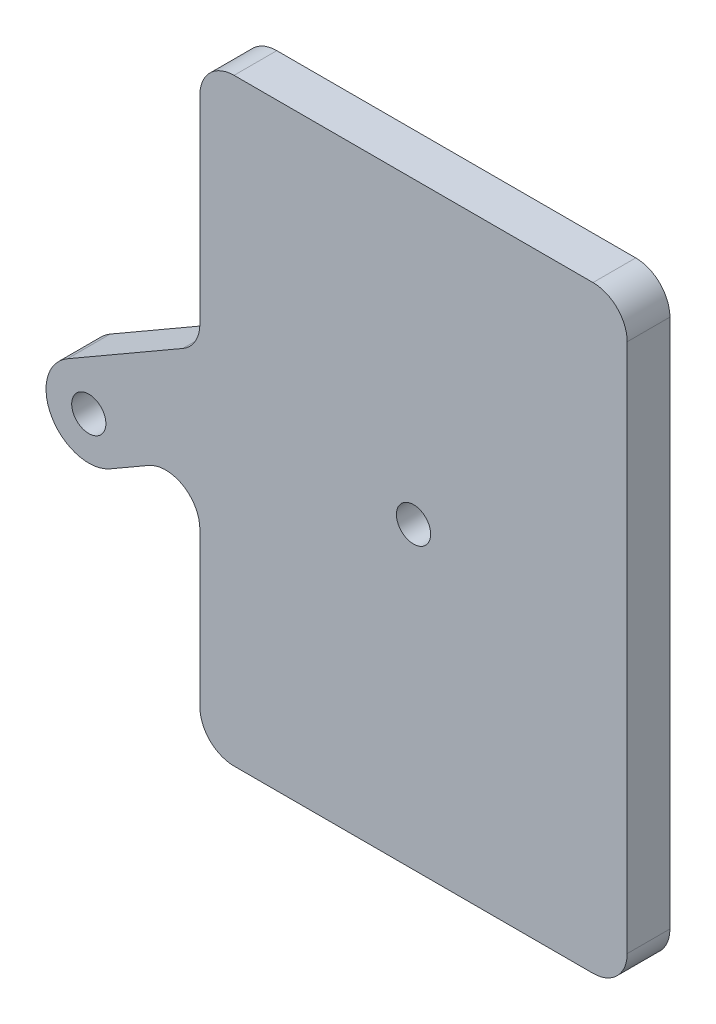
ISO-10303-21;
HEADER;
FILE_DESCRIPTION(('STEP AP214'),'2;1');
FILE_NAME('part.step','',(''),(''),'','','');
FILE_SCHEMA(('AUTOMOTIVE_DESIGN { 1 0 10303 214 1 1 1 1 }'));
ENDSEC;
DATA;
#1=APPLICATION_CONTEXT('core data for automotive mechanical design processes');
#2=APPLICATION_PROTOCOL_DEFINITION('international standard','automotive_design',2000,#1);
#3=PRODUCT_CONTEXT('',#1,'mechanical');
#4=PRODUCT('Part','Part','',(#3));
#5=PRODUCT_RELATED_PRODUCT_CATEGORY('part','',(#4));
#6=PRODUCT_DEFINITION_FORMATION('','',#4);
#7=PRODUCT_DEFINITION_CONTEXT('part definition',#1,'design');
#8=PRODUCT_DEFINITION('design','',#6,#7);
#9=PRODUCT_DEFINITION_SHAPE('','',#8);
#10=(LENGTH_UNIT() NAMED_UNIT(*) SI_UNIT(.MILLI.,.METRE.));
#11=(NAMED_UNIT(*) PLANE_ANGLE_UNIT() SI_UNIT($,.RADIAN.));
#12=(NAMED_UNIT(*) SI_UNIT($,.STERADIAN.) SOLID_ANGLE_UNIT());
#13=UNCERTAINTY_MEASURE_WITH_UNIT(LENGTH_MEASURE(1.E-05),#10,'distance_accuracy_value','');
#14=(GEOMETRIC_REPRESENTATION_CONTEXT(3) GLOBAL_UNCERTAINTY_ASSIGNED_CONTEXT((#13)) GLOBAL_UNIT_ASSIGNED_CONTEXT((#10,
#11,#12)) REPRESENTATION_CONTEXT('',''));
#15=CARTESIAN_POINT('',(0.,0.,0.));
#16=DIRECTION('',(0.,0.,1.));
#17=DIRECTION('',(1.,0.,0.));
#18=AXIS2_PLACEMENT_3D('',#15,#16,#17);
#19=CARTESIAN_POINT('',(-38.,-7.80000000000001,2.5));
#20=DIRECTION('',(0.,0.,1.));
#21=DIRECTION('',(1.,0.,0.));
#22=AXIS2_PLACEMENT_3D('',#19,#20,#21);
#23=PLANE('',#22);
#24=CARTESIAN_POINT('',(0.,0.,2.5));
#25=DIRECTION('',(0.,0.,1.));
#26=DIRECTION('',(1.,0.,0.));
#27=AXIS2_PLACEMENT_3D('',#24,#25,#26);
#28=CIRCLE('',#27,2.);
#29=CARTESIAN_POINT('',(1.99999999999999,0.,2.5));
#30=VERTEX_POINT('',#29);
#31=EDGE_CURVE('E182',#30,#30,#28,.T.);
#32=ORIENTED_EDGE('',*,*,#31,.F.);
#33=EDGE_LOOP('',(#32));
#34=FACE_BOUND('',#33,.T.);
#35=CARTESIAN_POINT('',(-38.,-7.80000000000001,2.5));
#36=DIRECTION('',(0.,0.,1.));
#37=DIRECTION('',(1.,0.,0.));
#38=AXIS2_PLACEMENT_3D('',#35,#36,#37);
#39=CIRCLE('',#38,4.99999999999999);
#40=CARTESIAN_POINT('',(-40.5,-3.46987298107783,2.5));
#41=VERTEX_POINT('',#40);
#42=CARTESIAN_POINT('',(-35.5,-12.1301270189222,2.5));
#43=VERTEX_POINT('',#42);
#44=EDGE_CURVE('E218',#41,#43,#39,.T.);
#45=ORIENTED_EDGE('',*,*,#44,.T.);
#46=DIRECTION('',(0.866025403784437,0.500000000000003,0.));
#47=VECTOR('',#46,1.);
#48=CARTESIAN_POINT('',(-31.,-9.53205080756886,2.5));
#49=LINE('',#48,#47);
#50=CARTESIAN_POINT('',(-31.,-9.53205080756886,2.5));
#51=VERTEX_POINT('',#50);
#52=EDGE_CURVE('E118',#43,#51,#49,.T.);
#53=ORIENTED_EDGE('',*,*,#52,.T.);
#54=CARTESIAN_POINT('',(-29.,-12.9961524227066,2.5));
#55=DIRECTION('',(0.,0.,-1.));
#56=DIRECTION('',(1.,0.,0.));
#57=AXIS2_PLACEMENT_3D('',#54,#55,#56);
#58=CIRCLE('',#57,4.00000000000001);
#59=CARTESIAN_POINT('',(-25.,-12.9961524227066,2.5));
#60=VERTEX_POINT('',#59);
#61=EDGE_CURVE('E263',#51,#60,#58,.T.);
#62=ORIENTED_EDGE('',*,*,#61,.T.);
#63=DIRECTION('',(0.,-1.,0.));
#64=VECTOR('',#63,1.);
#65=CARTESIAN_POINT('',(-25.,-31.,2.5));
#66=LINE('',#65,#64);
#67=CARTESIAN_POINT('',(-25.,-31.,2.5));
#68=VERTEX_POINT('',#67);
#69=EDGE_CURVE('E283',#60,#68,#66,.T.);
#70=ORIENTED_EDGE('',*,*,#69,.T.);
#71=CARTESIAN_POINT('',(-21.,-31.,2.5));
#72=DIRECTION('',(0.,0.,1.));
#73=DIRECTION('',(-1.,0.,0.));
#74=AXIS2_PLACEMENT_3D('',#71,#72,#73);
#75=CIRCLE('',#74,4.);
#76=CARTESIAN_POINT('',(-21.,-35.,2.5));
#77=VERTEX_POINT('',#76);
#78=EDGE_CURVE('E279',#68,#77,#75,.T.);
#79=ORIENTED_EDGE('',*,*,#78,.T.);
#80=DIRECTION('',(1.,0.,0.));
#81=VECTOR('',#80,1.);
#82=CARTESIAN_POINT('',(-21.,-35.,2.5));
#83=LINE('',#82,#81);
#84=CARTESIAN_POINT('',(21.,-35.,2.5));
#85=VERTEX_POINT('',#84);
#86=EDGE_CURVE('E282',#77,#85,#83,.T.);
#87=ORIENTED_EDGE('',*,*,#86,.T.);
#88=CARTESIAN_POINT('',(21.,-31.,2.5));
#89=DIRECTION('',(0.,0.,1.));
#90=DIRECTION('',(1.,0.,0.));
#91=AXIS2_PLACEMENT_3D('',#88,#89,#90);
#92=CIRCLE('',#91,4.);
#93=CARTESIAN_POINT('',(25.,-31.,2.5));
#94=VERTEX_POINT('',#93);
#95=EDGE_CURVE('E287',#85,#94,#92,.T.);
#96=ORIENTED_EDGE('',*,*,#95,.T.);
#97=DIRECTION('',(0.,1.,0.));
#98=VECTOR('',#97,1.);
#99=CARTESIAN_POINT('',(25.,-31.,2.5));
#100=LINE('',#99,#98);
#101=CARTESIAN_POINT('',(25.,31.,2.5));
#102=VERTEX_POINT('',#101);
#103=EDGE_CURVE('E294',#94,#102,#100,.T.);
#104=ORIENTED_EDGE('',*,*,#103,.T.);
#105=CARTESIAN_POINT('',(21.,31.,2.5));
#106=DIRECTION('',(0.,0.,1.));
#107=DIRECTION('',(-1.,0.,0.));
#108=AXIS2_PLACEMENT_3D('',#105,#106,#107);
#109=CIRCLE('',#108,4.);
#110=CARTESIAN_POINT('',(21.,35.,2.5));
#111=VERTEX_POINT('',#110);
#112=EDGE_CURVE('E297',#102,#111,#109,.T.);
#113=ORIENTED_EDGE('',*,*,#112,.T.);
#114=DIRECTION('',(-1.,0.,0.));
#115=VECTOR('',#114,1.);
#116=CARTESIAN_POINT('',(-21.,35.,2.5));
#117=LINE('',#116,#115);
#118=CARTESIAN_POINT('',(-21.,35.,2.5));
#119=VERTEX_POINT('',#118);
#120=EDGE_CURVE('E300',#111,#119,#117,.T.);
#121=ORIENTED_EDGE('',*,*,#120,.T.);
#122=CARTESIAN_POINT('',(-21.,31.,2.5));
#123=DIRECTION('',(0.,0.,1.));
#124=DIRECTION('',(-1.,0.,0.));
#125=AXIS2_PLACEMENT_3D('',#122,#123,#124);
#126=CIRCLE('',#125,4.);
#127=CARTESIAN_POINT('',(-25.,31.,2.5));
#128=VERTEX_POINT('',#127);
#129=EDGE_CURVE('E155',#119,#128,#126,.T.);
#130=ORIENTED_EDGE('',*,*,#129,.T.);
#131=DIRECTION('',(0.,-1.,0.));
#132=VECTOR('',#131,1.);
#133=CARTESIAN_POINT('',(-25.,7.78845726811997,2.5));
#134=LINE('',#133,#132);
#135=CARTESIAN_POINT('',(-25.,7.78845726811997,2.5));
#136=VERTEX_POINT('',#135);
#137=EDGE_CURVE('E149',#128,#136,#134,.T.);
#138=ORIENTED_EDGE('',*,*,#137,.T.);
#139=CARTESIAN_POINT('',(-29.,7.78845726811997,2.5));
#140=DIRECTION('',(0.,0.,-1.));
#141=DIRECTION('',(-1.,0.,0.));
#142=AXIS2_PLACEMENT_3D('',#139,#140,#141);
#143=CIRCLE('',#142,4.);
#144=CARTESIAN_POINT('',(-27.,4.32435565298223,2.5));
#145=VERTEX_POINT('',#144);
#146=EDGE_CURVE('E153',#136,#145,#143,.T.);
#147=ORIENTED_EDGE('',*,*,#146,.T.);
#148=DIRECTION('',(-0.866025403784436,-0.500000000000005,0.));
#149=VECTOR('',#148,1.);
#150=CARTESIAN_POINT('',(-27.,4.32435565298223,2.5));
#151=LINE('',#150,#149);
#152=EDGE_CURVE('E57',#145,#41,#151,.T.);
#153=ORIENTED_EDGE('',*,*,#152,.T.);
#154=EDGE_LOOP('',(#45,#53,#62,#70,#79,#87,#96,#104,#113,#121,#130,#138,#147,#153));
#155=FACE_BOUND('',#154,.T.);
#156=CARTESIAN_POINT('',(-38.,-7.80000000000001,2.5));
#157=DIRECTION('',(0.,0.,1.));
#158=DIRECTION('',(1.,0.,0.));
#159=AXIS2_PLACEMENT_3D('',#156,#157,#158);
#160=CIRCLE('',#159,2.);
#161=CARTESIAN_POINT('',(-36.,-7.80000000000001,2.5));
#162=VERTEX_POINT('',#161);
#163=EDGE_CURVE('E344',#162,#162,#160,.T.);
#164=ORIENTED_EDGE('',*,*,#163,.F.);
#165=EDGE_LOOP('',(#164));
#166=FACE_BOUND('',#165,.T.);
#167=ADVANCED_FACE('F39',(#34,#155,#166),#23,.T.);
#168=CARTESIAN_POINT('',(-38.,-7.80000000000001,-2.5));
#169=DIRECTION('',(0.,0.,1.));
#170=DIRECTION('',(1.,0.,0.));
#171=AXIS2_PLACEMENT_3D('',#168,#169,#170);
#172=PLANE('',#171);
#173=CARTESIAN_POINT('',(-38.,-7.80000000000001,-2.5));
#174=DIRECTION('',(0.,0.,1.));
#175=DIRECTION('',(1.,0.,0.));
#176=AXIS2_PLACEMENT_3D('',#173,#174,#175);
#177=CIRCLE('',#176,4.99999999999999);
#178=CARTESIAN_POINT('',(-40.5,-3.46987298107783,-2.5));
#179=VERTEX_POINT('',#178);
#180=CARTESIAN_POINT('',(-35.5,-12.1301270189222,-2.5));
#181=VERTEX_POINT('',#180);
#182=EDGE_CURVE('E177',#179,#181,#177,.T.);
#183=ORIENTED_EDGE('',*,*,#182,.F.);
#184=DIRECTION('',(-0.866025403784436,-0.500000000000005,0.));
#185=VECTOR('',#184,1.);
#186=CARTESIAN_POINT('',(-27.,4.32435565298223,-2.5));
#187=LINE('',#186,#185);
#188=CARTESIAN_POINT('',(-27.,4.32435565298223,-2.5));
#189=VERTEX_POINT('',#188);
#190=EDGE_CURVE('E110',#189,#179,#187,.T.);
#191=ORIENTED_EDGE('',*,*,#190,.F.);
#192=CARTESIAN_POINT('',(-29.,7.78845726811997,-2.5));
#193=DIRECTION('',(0.,0.,-1.));
#194=DIRECTION('',(-1.,0.,0.));
#195=AXIS2_PLACEMENT_3D('',#192,#193,#194);
#196=CIRCLE('',#195,4.);
#197=CARTESIAN_POINT('',(-25.,7.78845726811997,-2.5));
#198=VERTEX_POINT('',#197);
#199=EDGE_CURVE('E104',#198,#189,#196,.T.);
#200=ORIENTED_EDGE('',*,*,#199,.F.);
#201=DIRECTION('',(0.,-1.,0.));
#202=VECTOR('',#201,1.);
#203=CARTESIAN_POINT('',(-25.,7.78845726811997,-2.5));
#204=LINE('',#203,#202);
#205=CARTESIAN_POINT('',(-25.,31.,-2.5));
#206=VERTEX_POINT('',#205);
#207=EDGE_CURVE('E164',#206,#198,#204,.T.);
#208=ORIENTED_EDGE('',*,*,#207,.F.);
#209=CARTESIAN_POINT('',(-21.,31.,-2.5));
#210=DIRECTION('',(0.,0.,1.));
#211=DIRECTION('',(-1.,0.,0.));
#212=AXIS2_PLACEMENT_3D('',#209,#210,#211);
#213=CIRCLE('',#212,4.);
#214=CARTESIAN_POINT('',(-21.,35.,-2.5));
#215=VERTEX_POINT('',#214);
#216=EDGE_CURVE('E209',#215,#206,#213,.T.);
#217=ORIENTED_EDGE('',*,*,#216,.F.);
#218=DIRECTION('',(-1.,0.,0.));
#219=VECTOR('',#218,1.);
#220=CARTESIAN_POINT('',(-21.,35.,-2.5));
#221=LINE('',#220,#219);
#222=CARTESIAN_POINT('',(21.,35.,-2.5));
#223=VERTEX_POINT('',#222);
#224=EDGE_CURVE('E206',#223,#215,#221,.T.);
#225=ORIENTED_EDGE('',*,*,#224,.F.);
#226=CARTESIAN_POINT('',(21.,31.,-2.5));
#227=DIRECTION('',(0.,0.,1.));
#228=DIRECTION('',(-1.,0.,0.));
#229=AXIS2_PLACEMENT_3D('',#226,#227,#228);
#230=CIRCLE('',#229,4.);
#231=CARTESIAN_POINT('',(25.,31.,-2.5));
#232=VERTEX_POINT('',#231);
#233=EDGE_CURVE('E203',#232,#223,#230,.T.);
#234=ORIENTED_EDGE('',*,*,#233,.F.);
#235=DIRECTION('',(0.,1.,0.));
#236=VECTOR('',#235,1.);
#237=CARTESIAN_POINT('',(25.,-31.,-2.5));
#238=LINE('',#237,#236);
#239=CARTESIAN_POINT('',(25.,-31.,-2.5));
#240=VERTEX_POINT('',#239);
#241=EDGE_CURVE('E200',#240,#232,#238,.T.);
#242=ORIENTED_EDGE('',*,*,#241,.F.);
#243=CARTESIAN_POINT('',(21.,-31.,-2.5));
#244=DIRECTION('',(0.,0.,1.));
#245=DIRECTION('',(1.,0.,0.));
#246=AXIS2_PLACEMENT_3D('',#243,#244,#245);
#247=CIRCLE('',#246,4.);
#248=CARTESIAN_POINT('',(21.,-35.,-2.5));
#249=VERTEX_POINT('',#248);
#250=EDGE_CURVE('E197',#249,#240,#247,.T.);
#251=ORIENTED_EDGE('',*,*,#250,.F.);
#252=DIRECTION('',(1.,0.,0.));
#253=VECTOR('',#252,1.);
#254=CARTESIAN_POINT('',(-21.,-35.,-2.5));
#255=LINE('',#254,#253);
#256=CARTESIAN_POINT('',(-21.,-35.,-2.5));
#257=VERTEX_POINT('',#256);
#258=EDGE_CURVE('E194',#257,#249,#255,.T.);
#259=ORIENTED_EDGE('',*,*,#258,.F.);
#260=CARTESIAN_POINT('',(-21.,-31.,-2.5));
#261=DIRECTION('',(0.,0.,1.));
#262=DIRECTION('',(-1.,0.,0.));
#263=AXIS2_PLACEMENT_3D('',#260,#261,#262);
#264=CIRCLE('',#263,4.);
#265=CARTESIAN_POINT('',(-25.,-31.,-2.5));
#266=VERTEX_POINT('',#265);
#267=EDGE_CURVE('E191',#266,#257,#264,.T.);
#268=ORIENTED_EDGE('',*,*,#267,.F.);
#269=DIRECTION('',(0.,-1.,0.));
#270=VECTOR('',#269,1.);
#271=CARTESIAN_POINT('',(-25.,-31.,-2.5));
#272=LINE('',#271,#270);
#273=CARTESIAN_POINT('',(-25.,-12.9961524227066,-2.5));
#274=VERTEX_POINT('',#273);
#275=EDGE_CURVE('E188',#274,#266,#272,.T.);
#276=ORIENTED_EDGE('',*,*,#275,.F.);
#277=CARTESIAN_POINT('',(-29.,-12.9961524227066,-2.5));
#278=DIRECTION('',(0.,0.,-1.));
#279=DIRECTION('',(1.,0.,0.));
#280=AXIS2_PLACEMENT_3D('',#277,#278,#279);
#281=CIRCLE('',#280,4.00000000000001);
#282=CARTESIAN_POINT('',(-31.,-9.53205080756886,-2.5));
#283=VERTEX_POINT('',#282);
#284=EDGE_CURVE('E185',#283,#274,#281,.T.);
#285=ORIENTED_EDGE('',*,*,#284,.F.);
#286=DIRECTION('',(0.866025403784437,0.500000000000003,0.));
#287=VECTOR('',#286,1.);
#288=CARTESIAN_POINT('',(-31.,-9.53205080756886,-2.5));
#289=LINE('',#288,#287);
#290=EDGE_CURVE('E181',#181,#283,#289,.T.);
#291=ORIENTED_EDGE('',*,*,#290,.F.);
#292=EDGE_LOOP('',(#183,#191,#200,#208,#217,#225,#234,#242,#251,#259,#268,#276,#285,#291));
#293=FACE_BOUND('',#292,.T.);
#294=CARTESIAN_POINT('',(0.,0.,-2.5));
#295=DIRECTION('',(0.,0.,1.));
#296=DIRECTION('',(1.,0.,0.));
#297=AXIS2_PLACEMENT_3D('',#294,#295,#296);
#298=CIRCLE('',#297,2.);
#299=CARTESIAN_POINT('',(1.99999999999999,0.,-2.5));
#300=VERTEX_POINT('',#299);
#301=EDGE_CURVE('E352',#300,#300,#298,.T.);
#302=ORIENTED_EDGE('',*,*,#301,.T.);
#303=EDGE_LOOP('',(#302));
#304=FACE_BOUND('',#303,.T.);
#305=CARTESIAN_POINT('',(-38.,-7.80000000000001,-2.5));
#306=DIRECTION('',(0.,0.,1.));
#307=DIRECTION('',(1.,0.,0.));
#308=AXIS2_PLACEMENT_3D('',#305,#306,#307);
#309=CIRCLE('',#308,2.);
#310=CARTESIAN_POINT('',(-36.,-7.80000000000001,-2.5));
#311=VERTEX_POINT('',#310);
#312=EDGE_CURVE('E347',#311,#311,#309,.T.);
#313=ORIENTED_EDGE('',*,*,#312,.T.);
#314=EDGE_LOOP('',(#313));
#315=FACE_BOUND('',#314,.T.);
#316=ADVANCED_FACE('F267',(#293,#304,#315),#172,.F.);
#317=CARTESIAN_POINT('',(-38.,-7.80000000000001,2.5));
#318=DIRECTION('',(0.,0.,-1.));
#319=DIRECTION('',(-1.,0.,0.));
#320=AXIS2_PLACEMENT_3D('',#317,#318,#319);
#321=CYLINDRICAL_SURFACE('',#320,4.99999999999999);
#322=ORIENTED_EDGE('',*,*,#182,.T.);
#323=DIRECTION('',(0.,0.,-1.));
#324=VECTOR('',#323,1.);
#325=CARTESIAN_POINT('',(-35.5,-12.1301270189222,2.5));
#326=LINE('',#325,#324);
#327=EDGE_CURVE('E11',#43,#181,#326,.T.);
#328=ORIENTED_EDGE('',*,*,#327,.F.);
#329=ORIENTED_EDGE('',*,*,#44,.F.);
#330=DIRECTION('',(0.,0.,-1.));
#331=VECTOR('',#330,1.);
#332=CARTESIAN_POINT('',(-40.5,-3.46987298107783,2.5));
#333=LINE('',#332,#331);
#334=EDGE_CURVE('E173',#41,#179,#333,.T.);
#335=ORIENTED_EDGE('',*,*,#334,.T.);
#336=EDGE_LOOP('',(#322,#328,#329,#335));
#337=FACE_BOUND('',#336,.T.);
#338=ADVANCED_FACE('F41',(#337),#321,.T.);
#339=CARTESIAN_POINT('',(-31.,-9.53205080756886,2.5));
#340=DIRECTION('',(-0.500000000000003,0.866025403784437,0.));
#341=DIRECTION('',(-0.866025403784437,-0.500000000000003,0.));
#342=AXIS2_PLACEMENT_3D('',#339,#340,#341);
#343=PLANE('',#342);
#344=ORIENTED_EDGE('',*,*,#290,.T.);
#345=DIRECTION('',(0.,0.,-1.));
#346=VECTOR('',#345,1.);
#347=CARTESIAN_POINT('',(-31.,-9.53205080756886,2.5));
#348=LINE('',#347,#346);
#349=EDGE_CURVE('E49',#51,#283,#348,.T.);
#350=ORIENTED_EDGE('',*,*,#349,.F.);
#351=ORIENTED_EDGE('',*,*,#52,.F.);
#352=ORIENTED_EDGE('',*,*,#327,.T.);
#353=EDGE_LOOP('',(#344,#350,#351,#352));
#354=FACE_BOUND('',#353,.T.);
#355=ADVANCED_FACE('F470',(#354),#343,.F.);
#356=CARTESIAN_POINT('',(-29.,-12.9961524227066,2.5));
#357=DIRECTION('',(0.,0.,-1.));
#358=DIRECTION('',(-1.,0.,0.));
#359=AXIS2_PLACEMENT_3D('',#356,#357,#358);
#360=CYLINDRICAL_SURFACE('',#359,4.00000000000001);
#361=ORIENTED_EDGE('',*,*,#284,.T.);
#362=DIRECTION('',(0.,0.,-1.));
#363=VECTOR('',#362,1.);
#364=CARTESIAN_POINT('',(-25.,-12.9961524227066,2.5));
#365=LINE('',#364,#363);
#366=EDGE_CURVE('E253',#60,#274,#365,.T.);
#367=ORIENTED_EDGE('',*,*,#366,.F.);
#368=ORIENTED_EDGE('',*,*,#61,.F.);
#369=ORIENTED_EDGE('',*,*,#349,.T.);
#370=EDGE_LOOP('',(#361,#367,#368,#369));
#371=FACE_BOUND('',#370,.T.);
#372=ADVANCED_FACE('F261',(#371),#360,.F.);
#373=CARTESIAN_POINT('',(-25.,-31.,2.5));
#374=DIRECTION('',(1.,0.,0.));
#375=DIRECTION('',(0.,0.,-1.));
#376=AXIS2_PLACEMENT_3D('',#373,#374,#375);
#377=PLANE('',#376);
#378=ORIENTED_EDGE('',*,*,#275,.T.);
#379=DIRECTION('',(0.,0.,-1.));
#380=VECTOR('',#379,1.);
#381=CARTESIAN_POINT('',(-25.,-31.,2.5));
#382=LINE('',#381,#380);
#383=EDGE_CURVE('E249',#68,#266,#382,.T.);
#384=ORIENTED_EDGE('',*,*,#383,.F.);
#385=ORIENTED_EDGE('',*,*,#69,.F.);
#386=ORIENTED_EDGE('',*,*,#366,.T.);
#387=EDGE_LOOP('',(#378,#384,#385,#386));
#388=FACE_BOUND('',#387,.T.);
#389=ADVANCED_FACE('F273',(#388),#377,.F.);
#390=CARTESIAN_POINT('',(-21.,-31.,2.5));
#391=DIRECTION('',(0.,0.,-1.));
#392=DIRECTION('',(-1.,0.,0.));
#393=AXIS2_PLACEMENT_3D('',#390,#391,#392);
#394=CYLINDRICAL_SURFACE('',#393,4.);
#395=ORIENTED_EDGE('',*,*,#267,.T.);
#396=DIRECTION('',(0.,0.,-1.));
#397=VECTOR('',#396,1.);
#398=CARTESIAN_POINT('',(-21.,-35.,2.5));
#399=LINE('',#398,#397);
#400=EDGE_CURVE('E245',#77,#257,#399,.T.);
#401=ORIENTED_EDGE('',*,*,#400,.F.);
#402=ORIENTED_EDGE('',*,*,#78,.F.);
#403=ORIENTED_EDGE('',*,*,#383,.T.);
#404=EDGE_LOOP('',(#395,#401,#402,#403));
#405=FACE_BOUND('',#404,.T.);
#406=ADVANCED_FACE('F277',(#405),#394,.T.);
#407=CARTESIAN_POINT('',(-21.,-35.,2.5));
#408=DIRECTION('',(0.,1.,0.));
#409=DIRECTION('',(0.,0.,1.));
#410=AXIS2_PLACEMENT_3D('',#407,#408,#409);
#411=PLANE('',#410);
#412=ORIENTED_EDGE('',*,*,#258,.T.);
#413=DIRECTION('',(0.,0.,-1.));
#414=VECTOR('',#413,1.);
#415=CARTESIAN_POINT('',(21.,-35.,2.5));
#416=LINE('',#415,#414);
#417=EDGE_CURVE('E241',#85,#249,#416,.T.);
#418=ORIENTED_EDGE('',*,*,#417,.F.);
#419=ORIENTED_EDGE('',*,*,#86,.F.);
#420=ORIENTED_EDGE('',*,*,#400,.T.);
#421=EDGE_LOOP('',(#412,#418,#419,#420));
#422=FACE_BOUND('',#421,.T.);
#423=ADVANCED_FACE('F435',(#422),#411,.F.);
#424=CARTESIAN_POINT('',(21.,-31.,2.5));
#425=DIRECTION('',(0.,0.,-1.));
#426=DIRECTION('',(-1.,0.,0.));
#427=AXIS2_PLACEMENT_3D('',#424,#425,#426);
#428=CYLINDRICAL_SURFACE('',#427,4.);
#429=ORIENTED_EDGE('',*,*,#250,.T.);
#430=DIRECTION('',(0.,0.,-1.));
#431=VECTOR('',#430,1.);
#432=CARTESIAN_POINT('',(25.,-31.,2.5));
#433=LINE('',#432,#431);
#434=EDGE_CURVE('E237',#94,#240,#433,.T.);
#435=ORIENTED_EDGE('',*,*,#434,.F.);
#436=ORIENTED_EDGE('',*,*,#95,.F.);
#437=ORIENTED_EDGE('',*,*,#417,.T.);
#438=EDGE_LOOP('',(#429,#435,#436,#437));
#439=FACE_BOUND('',#438,.T.);
#440=ADVANCED_FACE('F425',(#439),#428,.T.);
#441=CARTESIAN_POINT('',(25.,-31.,2.5));
#442=DIRECTION('',(-1.,0.,0.));
#443=DIRECTION('',(0.,0.,1.));
#444=AXIS2_PLACEMENT_3D('',#441,#442,#443);
#445=PLANE('',#444);
#446=ORIENTED_EDGE('',*,*,#241,.T.);
#447=DIRECTION('',(0.,0.,-1.));
#448=VECTOR('',#447,1.);
#449=CARTESIAN_POINT('',(25.,31.,2.5));
#450=LINE('',#449,#448);
#451=EDGE_CURVE('E233',#102,#232,#450,.T.);
#452=ORIENTED_EDGE('',*,*,#451,.F.);
#453=ORIENTED_EDGE('',*,*,#103,.F.);
#454=ORIENTED_EDGE('',*,*,#434,.T.);
#455=EDGE_LOOP('',(#446,#452,#453,#454));
#456=FACE_BOUND('',#455,.T.);
#457=ADVANCED_FACE('F415',(#456),#445,.F.);
#458=CARTESIAN_POINT('',(21.,31.,2.5));
#459=DIRECTION('',(0.,0.,-1.));
#460=DIRECTION('',(-1.,0.,0.));
#461=AXIS2_PLACEMENT_3D('',#458,#459,#460);
#462=CYLINDRICAL_SURFACE('',#461,4.);
#463=ORIENTED_EDGE('',*,*,#233,.T.);
#464=DIRECTION('',(0.,0.,-1.));
#465=VECTOR('',#464,1.);
#466=CARTESIAN_POINT('',(21.,35.,2.5));
#467=LINE('',#466,#465);
#468=EDGE_CURVE('E229',#111,#223,#467,.T.);
#469=ORIENTED_EDGE('',*,*,#468,.F.);
#470=ORIENTED_EDGE('',*,*,#112,.F.);
#471=ORIENTED_EDGE('',*,*,#451,.T.);
#472=EDGE_LOOP('',(#463,#469,#470,#471));
#473=FACE_BOUND('',#472,.T.);
#474=ADVANCED_FACE('F406',(#473),#462,.T.);
#475=CARTESIAN_POINT('',(-21.,35.,2.5));
#476=DIRECTION('',(0.,-1.,0.));
#477=DIRECTION('',(0.,0.,-1.));
#478=AXIS2_PLACEMENT_3D('',#475,#476,#477);
#479=PLANE('',#478);
#480=ORIENTED_EDGE('',*,*,#224,.T.);
#481=DIRECTION('',(0.,0.,-1.));
#482=VECTOR('',#481,1.);
#483=CARTESIAN_POINT('',(-21.,35.,2.5));
#484=LINE('',#483,#482);
#485=EDGE_CURVE('E225',#119,#215,#484,.T.);
#486=ORIENTED_EDGE('',*,*,#485,.F.);
#487=ORIENTED_EDGE('',*,*,#120,.F.);
#488=ORIENTED_EDGE('',*,*,#468,.T.);
#489=EDGE_LOOP('',(#480,#486,#487,#488));
#490=FACE_BOUND('',#489,.T.);
#491=ADVANCED_FACE('F308',(#490),#479,.F.);
#492=CARTESIAN_POINT('',(-21.,31.,2.5));
#493=DIRECTION('',(0.,0.,-1.));
#494=DIRECTION('',(-1.,0.,0.));
#495=AXIS2_PLACEMENT_3D('',#492,#493,#494);
#496=CYLINDRICAL_SURFACE('',#495,4.);
#497=ORIENTED_EDGE('',*,*,#216,.T.);
#498=DIRECTION('',(0.,0.,-1.));
#499=VECTOR('',#498,1.);
#500=CARTESIAN_POINT('',(-25.,31.,2.5));
#501=LINE('',#500,#499);
#502=EDGE_CURVE('E166',#128,#206,#501,.T.);
#503=ORIENTED_EDGE('',*,*,#502,.F.);
#504=ORIENTED_EDGE('',*,*,#129,.F.);
#505=ORIENTED_EDGE('',*,*,#485,.T.);
#506=EDGE_LOOP('',(#497,#503,#504,#505));
#507=FACE_BOUND('',#506,.T.);
#508=ADVANCED_FACE('F312',(#507),#496,.T.);
#509=CARTESIAN_POINT('',(-25.,7.78845726811997,2.5));
#510=DIRECTION('',(1.,0.,0.));
#511=DIRECTION('',(0.,0.,-1.));
#512=AXIS2_PLACEMENT_3D('',#509,#510,#511);
#513=PLANE('',#512);
#514=ORIENTED_EDGE('',*,*,#207,.T.);
#515=DIRECTION('',(0.,0.,-1.));
#516=VECTOR('',#515,1.);
#517=CARTESIAN_POINT('',(-25.,7.78845726811997,2.5));
#518=LINE('',#517,#516);
#519=EDGE_CURVE('E161',#136,#198,#518,.T.);
#520=ORIENTED_EDGE('',*,*,#519,.F.);
#521=ORIENTED_EDGE('',*,*,#137,.F.);
#522=ORIENTED_EDGE('',*,*,#502,.T.);
#523=EDGE_LOOP('',(#514,#520,#521,#522));
#524=FACE_BOUND('',#523,.T.);
#525=ADVANCED_FACE('F162',(#524),#513,.F.);
#526=CARTESIAN_POINT('',(-29.,7.78845726811997,2.5));
#527=DIRECTION('',(0.,0.,-1.));
#528=DIRECTION('',(-1.,0.,0.));
#529=AXIS2_PLACEMENT_3D('',#526,#527,#528);
#530=CYLINDRICAL_SURFACE('',#529,4.);
#531=ORIENTED_EDGE('',*,*,#199,.T.);
#532=DIRECTION('',(0.,0.,-1.));
#533=VECTOR('',#532,1.);
#534=CARTESIAN_POINT('',(-27.,4.32435565298223,2.5));
#535=LINE('',#534,#533);
#536=EDGE_CURVE('E167',#145,#189,#535,.T.);
#537=ORIENTED_EDGE('',*,*,#536,.F.);
#538=ORIENTED_EDGE('',*,*,#146,.F.);
#539=ORIENTED_EDGE('',*,*,#519,.T.);
#540=EDGE_LOOP('',(#531,#537,#538,#539));
#541=FACE_BOUND('',#540,.T.);
#542=ADVANCED_FACE('F169',(#541),#530,.F.);
#543=CARTESIAN_POINT('',(-27.,4.32435565298223,2.5));
#544=DIRECTION('',(0.500000000000005,-0.866025403784436,0.));
#545=DIRECTION('',(0.866025403784436,0.500000000000005,0.));
#546=AXIS2_PLACEMENT_3D('',#543,#544,#545);
#547=PLANE('',#546);
#548=ORIENTED_EDGE('',*,*,#190,.T.);
#549=ORIENTED_EDGE('',*,*,#334,.F.);
#550=ORIENTED_EDGE('',*,*,#152,.F.);
#551=ORIENTED_EDGE('',*,*,#536,.T.);
#552=EDGE_LOOP('',(#548,#549,#550,#551));
#553=FACE_BOUND('',#552,.T.);
#554=ADVANCED_FACE('F316',(#553),#547,.F.);
#555=CARTESIAN_POINT('',(0.,0.,2.5));
#556=DIRECTION('',(0.,0.,-1.));
#557=DIRECTION('',(-1.,0.,0.));
#558=AXIS2_PLACEMENT_3D('',#555,#556,#557);
#559=CYLINDRICAL_SURFACE('',#558,2.);
#560=ORIENTED_EDGE('',*,*,#31,.T.);
#561=EDGE_LOOP('',(#560));
#562=FACE_BOUND('',#561,.T.);
#563=ORIENTED_EDGE('',*,*,#301,.F.);
#564=EDGE_LOOP('',(#563));
#565=FACE_BOUND('',#564,.T.);
#566=ADVANCED_FACE('F318',(#562,#565),#559,.F.);
#567=CARTESIAN_POINT('',(-38.,-7.80000000000001,2.5));
#568=DIRECTION('',(0.,0.,-1.));
#569=DIRECTION('',(-1.,0.,0.));
#570=AXIS2_PLACEMENT_3D('',#567,#568,#569);
#571=CYLINDRICAL_SURFACE('',#570,2.);
#572=ORIENTED_EDGE('',*,*,#163,.T.);
#573=EDGE_LOOP('',(#572));
#574=FACE_BOUND('',#573,.T.);
#575=ORIENTED_EDGE('',*,*,#312,.F.);
#576=EDGE_LOOP('',(#575));
#577=FACE_BOUND('',#576,.T.);
#578=ADVANCED_FACE('F324',(#574,#577),#571,.F.);
#579=CLOSED_SHELL('',(#167,#316,#338,#355,#372,#389,#406,#423,#440,#457,#474,#491,#508,#525,
#542,#554,#566,#578));
#580=MANIFOLD_SOLID_BREP('B2',#579);
#581=ADVANCED_BREP_SHAPE_REPRESENTATION('',(#18,#580),#14);
#582=SHAPE_DEFINITION_REPRESENTATION(#9,#581);
ENDSEC;
END-ISO-10303-21;
